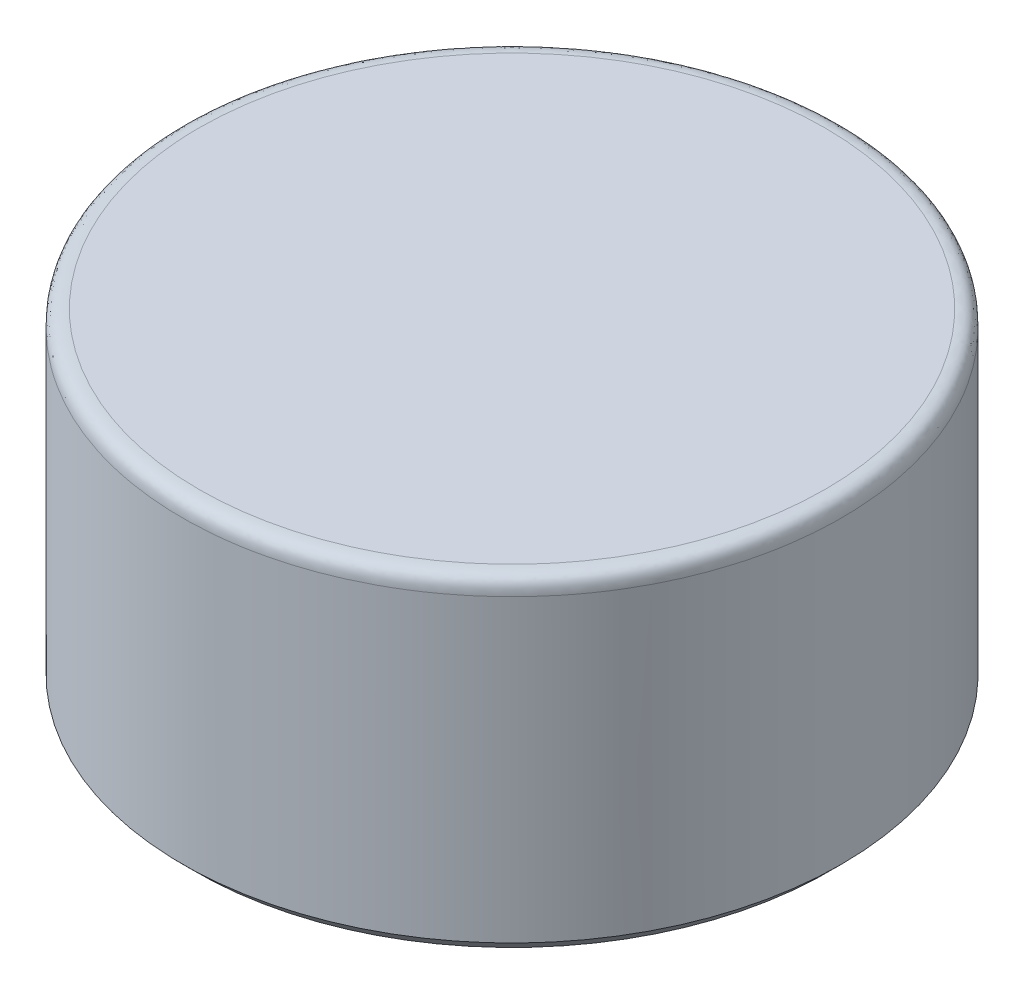
ISO-10303-21;
HEADER;
FILE_DESCRIPTION(('STEP AP214'),'2;1');
FILE_NAME('part.step','',(''),(''),'','','');
FILE_SCHEMA(('AUTOMOTIVE_DESIGN { 1 0 10303 214 1 1 1 1 }'));
ENDSEC;
DATA;
#1=APPLICATION_CONTEXT('core data for automotive mechanical design processes');
#2=APPLICATION_PROTOCOL_DEFINITION('international standard','automotive_design',2000,#1);
#3=PRODUCT_CONTEXT('',#1,'mechanical');
#4=PRODUCT('Part','Part','',(#3));
#5=PRODUCT_RELATED_PRODUCT_CATEGORY('part','',(#4));
#6=PRODUCT_DEFINITION_FORMATION('','',#4);
#7=PRODUCT_DEFINITION_CONTEXT('part definition',#1,'design');
#8=PRODUCT_DEFINITION('design','',#6,#7);
#9=PRODUCT_DEFINITION_SHAPE('','',#8);
#10=(LENGTH_UNIT() NAMED_UNIT(*) SI_UNIT(.MILLI.,.METRE.));
#11=(NAMED_UNIT(*) PLANE_ANGLE_UNIT() SI_UNIT($,.RADIAN.));
#12=(NAMED_UNIT(*) SI_UNIT($,.STERADIAN.) SOLID_ANGLE_UNIT());
#13=UNCERTAINTY_MEASURE_WITH_UNIT(LENGTH_MEASURE(1.E-05),#10,'distance_accuracy_value','');
#14=(GEOMETRIC_REPRESENTATION_CONTEXT(3) GLOBAL_UNCERTAINTY_ASSIGNED_CONTEXT((#13)) GLOBAL_UNIT_ASSIGNED_CONTEXT((#10,
#11,#12)) REPRESENTATION_CONTEXT('',''));
#15=CARTESIAN_POINT('',(0.,0.,0.));
#16=DIRECTION('',(0.,0.,1.));
#17=DIRECTION('',(1.,0.,0.));
#18=AXIS2_PLACEMENT_3D('',#15,#16,#17);
#19=CARTESIAN_POINT('',(9.,0.,0.));
#20=DIRECTION('',(0.,1.,0.));
#21=DIRECTION('',(-1.,0.,0.));
#22=AXIS2_PLACEMENT_3D('',#19,#20,#21);
#23=PLANE('',#22);
#24=CARTESIAN_POINT('',(0.,0.,0.));
#25=DIRECTION('',(0.,1.,0.));
#26=DIRECTION('',(-1.,0.,0.));
#27=AXIS2_PLACEMENT_3D('',#24,#25,#26);
#28=CIRCLE('',#27,9.6);
#29=CARTESIAN_POINT('',(-9.6,0.,0.));
#30=VERTEX_POINT('',#29);
#31=EDGE_CURVE('E10',#30,#30,#28,.F.);
#32=ORIENTED_EDGE('',*,*,#31,.T.);
#33=EDGE_LOOP('',(#32));
#34=FACE_BOUND('',#33,.T.);
#35=CARTESIAN_POINT('',(0.,0.,0.));
#36=DIRECTION('',(0.,1.,0.));
#37=DIRECTION('',(-1.,0.,0.));
#38=AXIS2_PLACEMENT_3D('',#35,#36,#37);
#39=CIRCLE('',#38,9.);
#40=CARTESIAN_POINT('',(-9.,0.,0.));
#41=VERTEX_POINT('',#40);
#42=EDGE_CURVE('E121',#41,#41,#39,.T.);
#43=ORIENTED_EDGE('',*,*,#42,.T.);
#44=EDGE_LOOP('',(#43));
#45=FACE_BOUND('',#44,.T.);
#46=ADVANCED_FACE('F32',(#34,#45),#23,.F.);
#47=CARTESIAN_POINT('',(0.,10.,0.));
#48=DIRECTION('',(0.,1.,0.));
#49=DIRECTION('',(-1.,0.,0.));
#50=AXIS2_PLACEMENT_3D('',#47,#48,#49);
#51=CYLINDRICAL_SURFACE('',#50,10.);
#52=CARTESIAN_POINT('',(0.,0.399999999999998,0.));
#53=DIRECTION('',(0.,1.,0.));
#54=DIRECTION('',(-1.,0.,0.));
#55=AXIS2_PLACEMENT_3D('',#52,#53,#54);
#56=CIRCLE('',#55,10.);
#57=CARTESIAN_POINT('',(-10.,0.399999999999996,0.));
#58=VERTEX_POINT('',#57);
#59=EDGE_CURVE('E39',#58,#58,#56,.T.);
#60=ORIENTED_EDGE('',*,*,#59,.T.);
#61=EDGE_LOOP('',(#60));
#62=FACE_BOUND('',#61,.T.);
#63=CARTESIAN_POINT('',(-10.,9.49999999999999,0.));
#64=CARTESIAN_POINT('',(-10.,9.49999999999999,1.30882079138332));
#65=CARTESIAN_POINT('',(-9.47931871582045,9.49999999999999,3.92646237414997));
#66=CARTESIAN_POINT('',(-7.25515644530562,9.49999999999999,7.2551564453056));
#67=CARTESIAN_POINT('',(-3.92646237414995,9.5,9.47931871582046));
#68=CARTESIAN_POINT('',(0.,9.5,10.2603406420898));
#69=CARTESIAN_POINT('',(3.92646237414994,9.5,9.47931871582046));
#70=CARTESIAN_POINT('',(7.25515644530562,9.5,7.25515644530561));
#71=CARTESIAN_POINT('',(9.47931871582046,9.5,3.92646237414994));
#72=CARTESIAN_POINT('',(10.2603406420898,9.5,0.));
#73=CARTESIAN_POINT('',(9.47931871582045,9.5,-3.92646237414994));
#74=CARTESIAN_POINT('',(7.25515644530562,9.5,-7.25515644530561));
#75=CARTESIAN_POINT('',(3.92646237414994,9.5,-9.47931871582046));
#76=CARTESIAN_POINT('',(0.,9.5,-10.2603406420898));
#77=CARTESIAN_POINT('',(-3.92646237414998,9.5,-9.47931871582045));
#78=CARTESIAN_POINT('',(-7.25515644530559,9.49999999999999,-7.25515644530563));
#79=CARTESIAN_POINT('',(-9.47931871582047,9.5,-3.92646237414992));
#80=CARTESIAN_POINT('',(-10.,9.49999999999999,-1.30882079138331));
#81=CARTESIAN_POINT('',(-10.,9.49999999999999,0.));
#82=B_SPLINE_CURVE_WITH_KNOTS('',3,(#63,#64,#65,#66,#67,#68,#69,#70,#71,#72,#73,#74,#75,#76,#77,
#78,#79,#80,#81),.UNSPECIFIED.,.T.,.F.,(4,1,1,1,1,1,1,1,1,1,1,1,1,1,1,1,4),(-3.14159265358979,
-2.74889357189107,-2.35619449019234,-1.96349540849362,-1.5707963267949,-1.17809724509617,
-0.785398163397448,-0.392699081698724,0.,0.392699081698724,0.785398163397448,1.17809724509617,
1.5707963267949,1.96349540849362,2.35619449019235,2.74889357189107,3.14159265358979),.UNSPECIFIED.);
#83=CARTESIAN_POINT('',(-10.,9.49999999999999,0.));
#84=VERTEX_POINT('',#83);
#85=EDGE_CURVE('E43',#84,#84,#82,.F.);
#86=ORIENTED_EDGE('',*,*,#85,.T.);
#87=EDGE_LOOP('',(#86));
#88=FACE_BOUND('',#87,.T.);
#89=ADVANCED_FACE('F93',(#62,#88),#51,.T.);
#90=CARTESIAN_POINT('',(10.,10.,0.));
#91=DIRECTION('',(0.,-1.,0.));
#92=DIRECTION('',(1.,0.,0.));
#93=AXIS2_PLACEMENT_3D('',#90,#91,#92);
#94=PLANE('',#93);
#95=CARTESIAN_POINT('',(-9.50000000000001,9.99999999999999,0.));
#96=CARTESIAN_POINT('',(-9.50000000000001,9.99999999999999,-1.24337975181415));
#97=CARTESIAN_POINT('',(-9.00535278002946,10.,-3.73013925544242));
#98=CARTESIAN_POINT('',(-6.89239862304032,9.99999999999999,-6.89239862304035));
#99=CARTESIAN_POINT('',(-3.73013925544248,10.,-9.00535278002943));
#100=CARTESIAN_POINT('',(0.,10.,-9.7473236099853));
#101=CARTESIAN_POINT('',(3.73013925544245,10.,-9.00535278002944));
#102=CARTESIAN_POINT('',(6.89239862304035,10.,-6.89239862304033));
#103=CARTESIAN_POINT('',(9.00535278002944,10.,-3.73013925544245));
#104=CARTESIAN_POINT('',(9.7473236099853,10.,0.));
#105=CARTESIAN_POINT('',(9.00535278002944,10.,3.73013925544245));
#106=CARTESIAN_POINT('',(6.89239862304034,10.,6.89239862304034));
#107=CARTESIAN_POINT('',(3.73013925544244,10.,9.00535278002945));
#108=CARTESIAN_POINT('',(0.,9.99999999999999,9.74732360998529));
#109=CARTESIAN_POINT('',(-3.73013925544245,10.,9.00535278002945));
#110=CARTESIAN_POINT('',(-6.89239862304034,9.99999999999999,6.89239862304032));
#111=CARTESIAN_POINT('',(-9.00535278002944,10.,3.73013925544248));
#112=CARTESIAN_POINT('',(-9.50000000000001,9.99999999999999,1.24337975181415));
#113=CARTESIAN_POINT('',(-9.50000000000001,9.99999999999999,0.));
#114=B_SPLINE_CURVE_WITH_KNOTS('',3,(#95,#96,#97,#98,#99,#100,#101,#102,#103,#104,#105,#106,
#107,#108,#109,#110,#111,#112,#113),.UNSPECIFIED.,.T.,.F.,(4,1,1,1,1,1,1,1,1,1,1,1,1,1,1,1,4),
(-3.14159265358979,-2.74889357189107,-2.35619449019235,-1.96349540849362,-1.5707963267949,
-1.17809724509617,-0.785398163397448,-0.392699081698724,0.,0.392699081698724,0.785398163397448,
1.17809724509617,1.5707963267949,1.96349540849362,2.35619449019234,2.74889357189107,
3.14159265358979),.UNSPECIFIED.);
#115=CARTESIAN_POINT('',(-9.50000000000001,9.99999999999999,0.));
#116=VERTEX_POINT('',#115);
#117=EDGE_CURVE('E47',#116,#116,#114,.F.);
#118=ORIENTED_EDGE('',*,*,#117,.T.);
#119=EDGE_LOOP('',(#118));
#120=FACE_BOUND('',#119,.T.);
#121=ADVANCED_FACE('F102',(#120),#94,.F.);
#122=CARTESIAN_POINT('',(9.,9.,0.));
#123=DIRECTION('',(0.,1.,0.));
#124=DIRECTION('',(-1.,0.,0.));
#125=AXIS2_PLACEMENT_3D('',#122,#123,#124);
#126=PLANE('',#125);
#127=CARTESIAN_POINT('',(0.,9.,0.));
#128=DIRECTION('',(0.,1.,0.));
#129=DIRECTION('',(-1.,0.,0.));
#130=AXIS2_PLACEMENT_3D('',#127,#128,#129);
#131=CIRCLE('',#130,9.);
#132=CARTESIAN_POINT('',(-9.,9.,0.));
#133=VERTEX_POINT('',#132);
#134=EDGE_CURVE('E118',#133,#133,#131,.T.);
#135=ORIENTED_EDGE('',*,*,#134,.F.);
#136=EDGE_LOOP('',(#135));
#137=FACE_BOUND('',#136,.T.);
#138=ADVANCED_FACE('F106',(#137),#126,.F.);
#139=CARTESIAN_POINT('',(0.,10.,0.));
#140=DIRECTION('',(0.,1.,0.));
#141=DIRECTION('',(-1.,0.,0.));
#142=AXIS2_PLACEMENT_3D('',#139,#140,#141);
#143=CYLINDRICAL_SURFACE('',#142,9.);
#144=ORIENTED_EDGE('',*,*,#42,.F.);
#145=EDGE_LOOP('',(#144));
#146=FACE_BOUND('',#145,.T.);
#147=ORIENTED_EDGE('',*,*,#134,.T.);
#148=EDGE_LOOP('',(#147));
#149=FACE_BOUND('',#148,.T.);
#150=ADVANCED_FACE('F68',(#146,#149),#143,.F.);
#151=CARTESIAN_POINT('',(-10.,9.49999999999999,0.));
#152=CARTESIAN_POINT('',(-10.,9.49999999999999,-1.30882079138331));
#153=CARTESIAN_POINT('',(-9.47931871582047,9.5,-3.92646237414992));
#154=CARTESIAN_POINT('',(-7.25515644530559,9.49999999999999,-7.25515644530563));
#155=CARTESIAN_POINT('',(-3.92646237414998,9.5,-9.47931871582045));
#156=CARTESIAN_POINT('',(0.,9.5,-10.2603406420898));
#157=CARTESIAN_POINT('',(3.92646237414994,9.5,-9.47931871582046));
#158=CARTESIAN_POINT('',(7.25515644530562,9.5,-7.25515644530561));
#159=CARTESIAN_POINT('',(9.47931871582045,9.5,-3.92646237414994));
#160=CARTESIAN_POINT('',(10.2603406420898,9.5,0.));
#161=CARTESIAN_POINT('',(9.47931871582046,9.5,3.92646237414994));
#162=CARTESIAN_POINT('',(7.25515644530562,9.5,7.25515644530561));
#163=CARTESIAN_POINT('',(3.92646237414994,9.5,9.47931871582046));
#164=CARTESIAN_POINT('',(0.,9.5,10.2603406420898));
#165=CARTESIAN_POINT('',(-3.92646237414995,9.5,9.47931871582046));
#166=CARTESIAN_POINT('',(-7.25515644530562,9.49999999999999,7.2551564453056));
#167=CARTESIAN_POINT('',(-9.47931871582045,9.49999999999999,3.92646237414997));
#168=CARTESIAN_POINT('',(-10.,9.49999999999999,1.30882079138332));
#169=CARTESIAN_POINT('',(-10.,9.49999999999999,0.));
#170=CARTESIAN_POINT('',(-10.,9.58409902576697,0.));
#171=CARTESIAN_POINT('',(-10.,9.58409902576697,-1.30882079138331));
#172=CARTESIAN_POINT('',(-9.47931871582047,9.58409902576697,-3.92646237414992));
#173=CARTESIAN_POINT('',(-7.25515644530559,9.58409902576697,-7.25515644530563));
#174=CARTESIAN_POINT('',(-3.92646237414998,9.58409902576697,-9.47931871582045));
#175=CARTESIAN_POINT('',(0.,9.58409902576697,-10.2603406420898));
#176=CARTESIAN_POINT('',(3.92646237414994,9.58409902576697,-9.47931871582046));
#177=CARTESIAN_POINT('',(7.25515644530562,9.58409902576697,-7.25515644530561));
#178=CARTESIAN_POINT('',(9.47931871582045,9.58409902576697,-3.92646237414994));
#179=CARTESIAN_POINT('',(10.2603406420898,9.58409902576697,0.));
#180=CARTESIAN_POINT('',(9.47931871582046,9.58409902576697,3.92646237414994));
#181=CARTESIAN_POINT('',(7.25515644530562,9.58409902576697,7.25515644530561));
#182=CARTESIAN_POINT('',(3.92646237414994,9.58409902576697,9.47931871582046));
#183=CARTESIAN_POINT('',(0.,9.58409902576697,10.2603406420898));
#184=CARTESIAN_POINT('',(-3.92646237414995,9.58409902576697,9.47931871582046));
#185=CARTESIAN_POINT('',(-7.25515644530562,9.58409902576697,7.2551564453056));
#186=CARTESIAN_POINT('',(-9.47931871582045,9.58409902576697,3.92646237414997));
#187=CARTESIAN_POINT('',(-10.,9.58409902576697,1.30882079138332));
#188=CARTESIAN_POINT('',(-10.,9.58409902576697,0.));
#189=CARTESIAN_POINT('',(-10.,9.66819805153394,0.));
#190=CARTESIAN_POINT('',(-10.,9.66819805153394,-1.30882079138331));
#191=CARTESIAN_POINT('',(-9.47931871582047,9.66819805153395,-3.92646237414992));
#192=CARTESIAN_POINT('',(-7.25515644530559,9.66819805153394,-7.25515644530563));
#193=CARTESIAN_POINT('',(-3.92646237414998,9.66819805153395,-9.47931871582045));
#194=CARTESIAN_POINT('',(0.,9.66819805153395,-10.2603406420898));
#195=CARTESIAN_POINT('',(3.92646237414994,9.66819805153395,-9.47931871582046));
#196=CARTESIAN_POINT('',(7.25515644530562,9.66819805153395,-7.25515644530561));
#197=CARTESIAN_POINT('',(9.47931871582045,9.66819805153394,-3.92646237414994));
#198=CARTESIAN_POINT('',(10.2603406420898,9.66819805153395,0.));
#199=CARTESIAN_POINT('',(9.47931871582046,9.66819805153394,3.92646237414994));
#200=CARTESIAN_POINT('',(7.25515644530562,9.66819805153395,7.25515644530561));
#201=CARTESIAN_POINT('',(3.92646237414994,9.66819805153395,9.47931871582046));
#202=CARTESIAN_POINT('',(0.,9.66819805153395,10.2603406420898));
#203=CARTESIAN_POINT('',(-3.92646237414995,9.66819805153395,9.47931871582046));
#204=CARTESIAN_POINT('',(-7.25515644530562,9.66819805153394,7.2551564453056));
#205=CARTESIAN_POINT('',(-9.47931871582045,9.66819805153394,3.92646237414997));
#206=CARTESIAN_POINT('',(-10.,9.66819805153394,1.30882079138332));
#207=CARTESIAN_POINT('',(-10.,9.66819805153394,0.));
#208=CARTESIAN_POINT('',(-9.96415404008196,9.85355339059327,0.));
#209=CARTESIAN_POINT('',(-9.96415404008196,9.85355339059327,-1.30412919762053));
#210=CARTESIAN_POINT('',(-9.44533918794671,9.85355339059327,-3.91238759286157));
#211=CARTESIAN_POINT('',(-7.22914964059184,9.85355339059327,-7.22914964059187));
#212=CARTESIAN_POINT('',(-3.91238759286163,9.85355339059327,-9.44533918794668));
#213=CARTESIAN_POINT('',(0.,9.85355339059327,-10.2235614661496));
#214=CARTESIAN_POINT('',(3.91238759286159,9.85355339059327,-9.44533918794669));
#215=CARTESIAN_POINT('',(7.22914964059187,9.85355339059327,-7.22914964059186));
#216=CARTESIAN_POINT('',(9.44533918794669,9.85355339059327,-3.91238759286159));
#217=CARTESIAN_POINT('',(10.2235614661496,9.85355339059328,0.));
#218=CARTESIAN_POINT('',(9.44533918794669,9.85355339059328,3.9123875928616));
#219=CARTESIAN_POINT('',(7.22914964059186,9.85355339059327,7.22914964059186));
#220=CARTESIAN_POINT('',(3.91238759286159,9.85355339059327,9.4453391879467));
#221=CARTESIAN_POINT('',(0.,9.85355339059327,10.2235614661496));
#222=CARTESIAN_POINT('',(-3.9123875928616,9.85355339059327,9.4453391879467));
#223=CARTESIAN_POINT('',(-7.22914964059186,9.85355339059327,7.22914964059184));
#224=CARTESIAN_POINT('',(-9.44533918794669,9.85355339059327,3.91238759286162));
#225=CARTESIAN_POINT('',(-9.96415404008195,9.85355339059327,1.30412919762053));
#226=CARTESIAN_POINT('',(-9.96415404008196,9.85355339059327,0.));
#227=CARTESIAN_POINT('',(-9.85355339059327,9.96415404008195,0.));
#228=CARTESIAN_POINT('',(-9.85355339059328,9.96415404008195,-1.2896535546614));
#229=CARTESIAN_POINT('',(-9.34049730727871,9.96415404008195,-3.86896066398418));
#230=CARTESIAN_POINT('',(-7.14890713909256,9.96415404008196,-7.14890713909259));
#231=CARTESIAN_POINT('',(-3.86896066398424,9.96415404008195,-9.34049730727869));
#232=CARTESIAN_POINT('',(0.,9.96415404008196,-10.1100814322506));
#233=CARTESIAN_POINT('',(3.86896066398421,9.96415404008195,-9.3404973072787));
#234=CARTESIAN_POINT('',(7.14890713909259,9.96415404008196,-7.14890713909257));
#235=CARTESIAN_POINT('',(9.34049730727869,9.96415404008195,-3.86896066398421));
#236=CARTESIAN_POINT('',(10.1100814322506,9.96415404008196,0.));
#237=CARTESIAN_POINT('',(9.34049730727869,9.96415404008196,3.86896066398421));
#238=CARTESIAN_POINT('',(7.14890713909258,9.96415404008195,7.14890713909258));
#239=CARTESIAN_POINT('',(3.8689606639842,9.96415404008196,9.3404973072787));
#240=CARTESIAN_POINT('',(0.,9.96415404008196,10.1100814322506));
#241=CARTESIAN_POINT('',(-3.86896066398421,9.96415404008196,9.3404973072787));
#242=CARTESIAN_POINT('',(-7.14890713909258,9.96415404008195,7.14890713909256));
#243=CARTESIAN_POINT('',(-9.34049730727869,9.96415404008195,3.86896066398424));
#244=CARTESIAN_POINT('',(-9.85355339059327,9.96415404008195,1.2896535546614));
#245=CARTESIAN_POINT('',(-9.85355339059327,9.96415404008195,0.));
#246=CARTESIAN_POINT('',(-9.66819805153395,9.99999999999999,0.));
#247=CARTESIAN_POINT('',(-9.66819805153395,9.99999999999999,-1.26539386250593));
#248=CARTESIAN_POINT('',(-9.16479307381648,10.,-3.79618158751776));
#249=CARTESIAN_POINT('',(-7.01442894080775,9.99999999999999,-7.01442894080778));
#250=CARTESIAN_POINT('',(-3.79618158751781,10.,-9.16479307381645));
#251=CARTESIAN_POINT('',(0.,10.,-9.91990054039269));
#252=CARTESIAN_POINT('',(3.79618158751778,10.,-9.16479307381646));
#253=CARTESIAN_POINT('',(7.01442894080778,10.,-7.01442894080776));
#254=CARTESIAN_POINT('',(9.16479307381646,10.,-3.79618158751778));
#255=CARTESIAN_POINT('',(9.91990054039269,10.,0.));
#256=CARTESIAN_POINT('',(9.16479307381646,10.,3.79618158751778));
#257=CARTESIAN_POINT('',(7.01442894080777,10.,7.01442894080777));
#258=CARTESIAN_POINT('',(3.79618158751778,10.,9.16479307381647));
#259=CARTESIAN_POINT('',(0.,9.99999999999999,9.91990054039269));
#260=CARTESIAN_POINT('',(-3.79618158751779,10.,9.16479307381647));
#261=CARTESIAN_POINT('',(-7.01442894080777,9.99999999999999,7.01442894080775));
#262=CARTESIAN_POINT('',(-9.16479307381646,10.,3.79618158751781));
#263=CARTESIAN_POINT('',(-9.66819805153394,9.99999999999999,1.26539386250593));
#264=CARTESIAN_POINT('',(-9.66819805153395,9.99999999999999,0.));
#265=CARTESIAN_POINT('',(-9.58409902576697,9.99999999999999,0.));
#266=CARTESIAN_POINT('',(-9.58409902576698,9.99999999999999,-1.25438680716004));
#267=CARTESIAN_POINT('',(-9.08507292692296,10.,-3.76316042148009));
#268=CARTESIAN_POINT('',(-6.95341378192403,9.99999999999999,-6.95341378192406));
#269=CARTESIAN_POINT('',(-3.76316042148014,10.,-9.08507292692294));
#270=CARTESIAN_POINT('',(0.,10.,-9.83361207518899));
#271=CARTESIAN_POINT('',(3.76316042148011,10.,-9.08507292692295));
#272=CARTESIAN_POINT('',(6.95341378192406,10.,-6.95341378192404));
#273=CARTESIAN_POINT('',(9.08507292692295,10.,-3.76316042148011));
#274=CARTESIAN_POINT('',(9.83361207518899,10.,0.));
#275=CARTESIAN_POINT('',(9.08507292692295,10.,3.76316042148012));
#276=CARTESIAN_POINT('',(6.95341378192405,10.,6.95341378192405));
#277=CARTESIAN_POINT('',(3.76316042148011,10.,9.08507292692295));
#278=CARTESIAN_POINT('',(0.,9.99999999999999,9.83361207518899));
#279=CARTESIAN_POINT('',(-3.76316042148012,10.,9.08507292692295));
#280=CARTESIAN_POINT('',(-6.95341378192406,9.99999999999999,6.95341378192404));
#281=CARTESIAN_POINT('',(-9.08507292692294,10.,3.76316042148014));
#282=CARTESIAN_POINT('',(-9.58409902576697,9.99999999999999,1.25438680716004));
#283=CARTESIAN_POINT('',(-9.58409902576697,9.99999999999999,0.));
#284=CARTESIAN_POINT('',(-9.5,9.99999999999999,0.));
#285=CARTESIAN_POINT('',(-9.5,9.99999999999999,-1.24337975181415));
#286=CARTESIAN_POINT('',(-9.00535278002945,10.,-3.73013925544242));
#287=CARTESIAN_POINT('',(-6.89239862304031,9.99999999999999,-6.89239862304035));
#288=CARTESIAN_POINT('',(-3.73013925544248,10.,-9.00535278002942));
#289=CARTESIAN_POINT('',(0.,10.,-9.74732360998529));
#290=CARTESIAN_POINT('',(3.73013925544244,10.,-9.00535278002943));
#291=CARTESIAN_POINT('',(6.89239862304034,10.,-6.89239862304033));
#292=CARTESIAN_POINT('',(9.00535278002943,10.,-3.73013925544245));
#293=CARTESIAN_POINT('',(9.74732360998529,10.,0.));
#294=CARTESIAN_POINT('',(9.00535278002944,10.,3.73013925544245));
#295=CARTESIAN_POINT('',(6.89239862304034,10.,6.89239862304033));
#296=CARTESIAN_POINT('',(3.73013925544244,10.,9.00535278002944));
#297=CARTESIAN_POINT('',(0.,9.99999999999999,9.74732360998529));
#298=CARTESIAN_POINT('',(-3.73013925544245,10.,9.00535278002944));
#299=CARTESIAN_POINT('',(-6.89239862304034,9.99999999999999,6.89239862304032));
#300=CARTESIAN_POINT('',(-9.00535278002943,10.,3.73013925544247));
#301=CARTESIAN_POINT('',(-9.5,9.99999999999999,1.24337975181415));
#302=CARTESIAN_POINT('',(-9.5,9.99999999999999,0.));
#303=B_SPLINE_SURFACE_WITH_KNOTS('',5,3,((#151,#152,#153,#154,#155,#156,#157,#158,#159,#160,
#161,#162,#163,#164,#165,#166,#167,#168,#169),(#170,#171,#172,#173,#174,#175,#176,#177,#178,
#179,#180,#181,#182,#183,#184,#185,#186,#187,#188),(#189,#190,#191,#192,#193,#194,#195,#196,
#197,#198,#199,#200,#201,#202,#203,#204,#205,#206,#207),(#208,#209,#210,#211,#212,#213,#214,
#215,#216,#217,#218,#219,#220,#221,#222,#223,#224,#225,#226),(#227,#228,#229,#230,#231,#232,
#233,#234,#235,#236,#237,#238,#239,#240,#241,#242,#243,#244,#245),(#246,#247,#248,#249,#250,
#251,#252,#253,#254,#255,#256,#257,#258,#259,#260,#261,#262,#263,#264),(#265,#266,#267,#268,
#269,#270,#271,#272,#273,#274,#275,#276,#277,#278,#279,#280,#281,#282,#283),(#284,#285,#286,
#287,#288,#289,#290,#291,#292,#293,#294,#295,#296,#297,#298,#299,#300,#301,#302)),.UNSPECIFIED.,
.F.,.T.,.F.,(6,2,6),(4,1,1,1,1,1,1,1,1,1,1,1,1,1,1,1,4),(0.,0.5,1.),(-3.14159265358979,
-2.74889357189107,-2.35619449019235,-1.96349540849362,-1.5707963267949,-1.17809724509617,
-0.785398163397448,-0.392699081698724,0.,0.392699081698724,0.785398163397448,1.17809724509617,
1.5707963267949,1.96349540849362,2.35619449019234,2.74889357189107,3.14159265358979),.UNSPECIFIED.);
#304=ORIENTED_EDGE('',*,*,#85,.F.);
#305=EDGE_LOOP('',(#304));
#306=FACE_BOUND('',#305,.T.);
#307=ORIENTED_EDGE('',*,*,#117,.F.);
#308=EDGE_LOOP('',(#307));
#309=FACE_BOUND('',#308,.T.);
#310=ADVANCED_FACE('F55',(#306,#309),#303,.T.);
#311=CARTESIAN_POINT('',(0.,0.399999999999998,0.));
#312=DIRECTION('',(0.,1.,0.));
#313=DIRECTION('',(-1.,0.,0.));
#314=AXIS2_PLACEMENT_3D('',#311,#312,#313);
#315=CONICAL_SURFACE('',#314,10.,0.785398163397453);
#316=CARTESIAN_POINT('',(-9.6,0.,0.));
#317=CARTESIAN_POINT('',(-9.60416666666666,0.00416666666666435,0.));
#318=CARTESIAN_POINT('',(-9.60833333333333,0.008333333333331,0.));
#319=CARTESIAN_POINT('',(-9.61666666666666,0.0166666666666643,0.));
#320=CARTESIAN_POINT('',(-9.62083333333333,0.0208333333333309,0.));
#321=CARTESIAN_POINT('',(-9.62916666666666,0.0291666666666642,0.));
#322=CARTESIAN_POINT('',(-9.63333333333333,0.0333333333333309,0.));
#323=CARTESIAN_POINT('',(-9.64166666666666,0.0416666666666642,0.));
#324=CARTESIAN_POINT('',(-9.64583333333333,0.0458333333333307,0.));
#325=CARTESIAN_POINT('',(-9.65416666666667,0.0541666666666641,0.));
#326=CARTESIAN_POINT('',(-9.65833333333333,0.058333333333331,0.));
#327=CARTESIAN_POINT('',(-9.66666666666666,0.0666666666666643,0.));
#328=CARTESIAN_POINT('',(-9.67083333333333,0.0708333333333308,0.));
#329=CARTESIAN_POINT('',(-9.67916666666666,0.079166666666664,0.));
#330=CARTESIAN_POINT('',(-9.68333333333333,0.0833333333333307,0.));
#331=CARTESIAN_POINT('',(-9.69166666666666,0.0916666666666641,0.));
#332=CARTESIAN_POINT('',(-9.69583333333333,0.0958333333333307,0.));
#333=CARTESIAN_POINT('',(-9.70416666666666,0.104166666666664,0.));
#334=CARTESIAN_POINT('',(-9.70833333333333,0.108333333333331,0.));
#335=CARTESIAN_POINT('',(-9.71666666666667,0.116666666666664,0.));
#336=CARTESIAN_POINT('',(-9.72083333333333,0.12083333333333,0.));
#337=CARTESIAN_POINT('',(-9.72916666666667,0.129166666666664,0.));
#338=CARTESIAN_POINT('',(-9.73333333333333,0.133333333333331,0.));
#339=CARTESIAN_POINT('',(-9.74166666666666,0.141666666666664,0.));
#340=CARTESIAN_POINT('',(-9.74583333333333,0.145833333333331,0.));
#341=CARTESIAN_POINT('',(-9.75416666666666,0.154166666666664,0.));
#342=CARTESIAN_POINT('',(-9.75833333333333,0.15833333333333,0.));
#343=CARTESIAN_POINT('',(-9.76666666666666,0.166666666666664,0.));
#344=CARTESIAN_POINT('',(-9.77083333333333,0.17083333333333,0.));
#345=CARTESIAN_POINT('',(-9.77916666666667,0.179166666666664,0.));
#346=CARTESIAN_POINT('',(-9.78333333333333,0.18333333333333,0.));
#347=CARTESIAN_POINT('',(-9.79166666666667,0.191666666666664,0.));
#348=CARTESIAN_POINT('',(-9.79583333333333,0.19583333333333,0.));
#349=CARTESIAN_POINT('',(-9.80416666666667,0.204166666666664,0.));
#350=CARTESIAN_POINT('',(-9.80833333333333,0.20833333333333,0.));
#351=CARTESIAN_POINT('',(-9.81666666666666,0.216666666666664,0.));
#352=CARTESIAN_POINT('',(-9.82083333333333,0.22083333333333,0.));
#353=CARTESIAN_POINT('',(-9.82916666666667,0.229166666666664,0.));
#354=CARTESIAN_POINT('',(-9.83333333333333,0.23333333333333,0.));
#355=CARTESIAN_POINT('',(-9.84166666666667,0.241666666666664,0.));
#356=CARTESIAN_POINT('',(-9.84583333333333,0.24583333333333,0.));
#357=CARTESIAN_POINT('',(-9.85416666666667,0.254166666666663,0.));
#358=CARTESIAN_POINT('',(-9.85833333333333,0.25833333333333,0.));
#359=CARTESIAN_POINT('',(-9.86666666666667,0.266666666666664,0.));
#360=CARTESIAN_POINT('',(-9.87083333333333,0.27083333333333,0.));
#361=CARTESIAN_POINT('',(-9.87916666666667,0.279166666666663,0.));
#362=CARTESIAN_POINT('',(-9.88333333333333,0.28333333333333,0.));
#363=CARTESIAN_POINT('',(-9.89166666666667,0.291666666666663,0.));
#364=CARTESIAN_POINT('',(-9.89583333333333,0.29583333333333,0.));
#365=CARTESIAN_POINT('',(-9.90416666666667,0.304166666666664,0.));
#366=CARTESIAN_POINT('',(-9.90833333333333,0.30833333333333,0.));
#367=CARTESIAN_POINT('',(-9.91666666666667,0.316666666666663,0.));
#368=CARTESIAN_POINT('',(-9.92083333333333,0.32083333333333,0.));
#369=CARTESIAN_POINT('',(-9.92916666666667,0.329166666666663,0.));
#370=CARTESIAN_POINT('',(-9.93333333333333,0.33333333333333,0.));
#371=CARTESIAN_POINT('',(-9.94166666666667,0.341666666666663,0.));
#372=CARTESIAN_POINT('',(-9.94583333333333,0.34583333333333,0.));
#373=CARTESIAN_POINT('',(-9.95416666666667,0.354166666666663,0.));
#374=CARTESIAN_POINT('',(-9.95833333333333,0.35833333333333,0.));
#375=CARTESIAN_POINT('',(-9.96666666666667,0.366666666666663,0.));
#376=CARTESIAN_POINT('',(-9.97083333333333,0.37083333333333,0.));
#377=CARTESIAN_POINT('',(-9.97916666666667,0.379166666666663,0.));
#378=CARTESIAN_POINT('',(-9.98333333333333,0.38333333333333,0.));
#379=CARTESIAN_POINT('',(-9.99166666666667,0.391666666666663,0.));
#380=CARTESIAN_POINT('',(-9.99583333333333,0.39583333333333,0.));
#381=CARTESIAN_POINT('',(-10.,0.399999999999996,0.));
#382=B_SPLINE_CURVE_WITH_KNOTS('',3,(#316,#317,#318,#319,#320,#321,#322,#323,#324,#325,#326,
#327,#328,#329,#330,#331,#332,#333,#334,#335,#336,#337,#338,#339,#340,#341,#342,#343,#344,#345,
#346,#347,#348,#349,#350,#351,#352,#353,#354,#355,#356,#357,#358,#359,#360,#361,#362,#363,#364,
#365,#366,#367,#368,#369,#370,#371,#372,#373,#374,#375,#376,#377,#378,#379,#380,#381),
.UNSPECIFIED.,.F.,.F.,(4,2,2,2,2,2,2,2,2,2,2,2,2,2,2,2,2,2,2,2,2,2,2,2,2,2,2,2,2,2,2,2,4),(0.,
0.0176776695296639,0.0353553390593278,0.0530330085889917,0.0707106781186557,0.0883883476483184,
0.106066017177982,0.123743686707646,0.14142135623731,0.159099025766974,0.176776695296638,
0.194454364826301,0.212132034355965,0.229809703885628,0.247487373415292,0.265165042944956,
0.28284271247462,0.300520382004283,0.318198051533947,0.335875721063611,0.353553390593275,
0.371231060122939,0.388908729652603,0.406586399182266,0.424264068711929,0.441941738241593,
0.459619407771257,0.477297077300921,0.494974746830585,0.512652416360249,0.530330085889911,
0.548007755419575,0.565685424949239),.UNSPECIFIED.);
#383=EDGE_CURVE('BSEAM34',#30,#58,#382,.T.);
#384=ORIENTED_EDGE('',*,*,#31,.F.);
#385=ORIENTED_EDGE('',*,*,#59,.F.);
#386=ORIENTED_EDGE('',*,*,#383,.T.);
#387=ORIENTED_EDGE('',*,*,#383,.F.);
#388=EDGE_LOOP('',(#384,#386,#385,#387));
#389=FACE_BOUND('',#388,.T.);
#390=ADVANCED_FACE('F34',(#389),#315,.T.);
#391=CLOSED_SHELL('',(#46,#89,#121,#138,#150,#310,#390));
#392=MANIFOLD_SOLID_BREP('B2',#391);
#393=ADVANCED_BREP_SHAPE_REPRESENTATION('',(#18,#392),#14);
#394=SHAPE_DEFINITION_REPRESENTATION(#9,#393);
ENDSEC;
END-ISO-10303-21;
